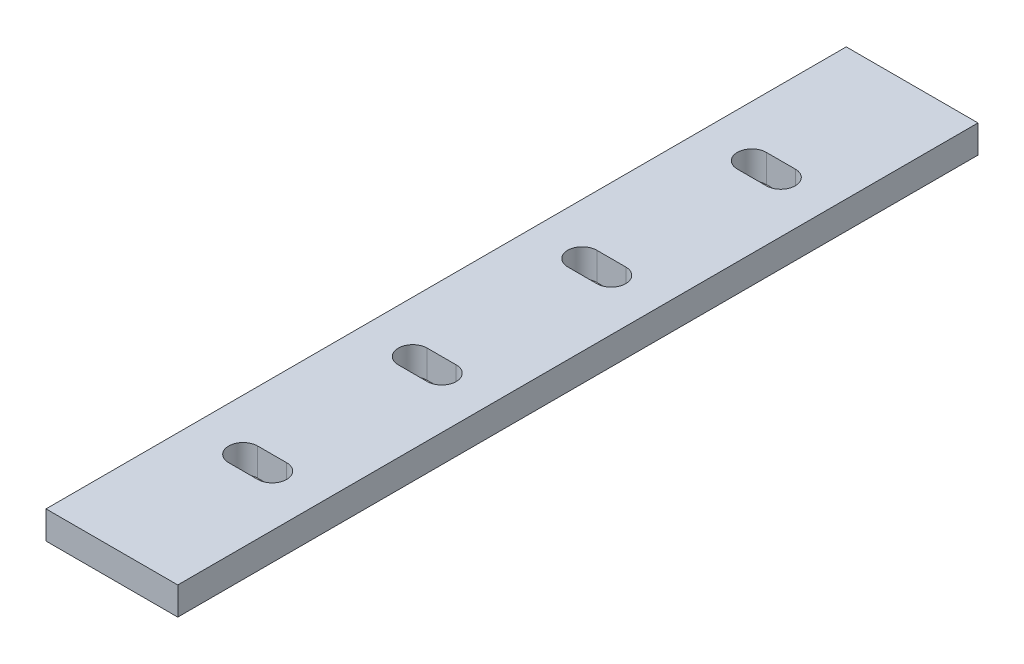
ISO-10303-21;
HEADER;
FILE_DESCRIPTION(('STEP AP214'),'2;1');
FILE_NAME('part.step','',(''),(''),'','','');
FILE_SCHEMA(('AUTOMOTIVE_DESIGN { 1 0 10303 214 1 1 1 1 }'));
ENDSEC;
DATA;
#1=APPLICATION_CONTEXT('core data for automotive mechanical design processes');
#2=APPLICATION_PROTOCOL_DEFINITION('international standard','automotive_design',2000,#1);
#3=PRODUCT_CONTEXT('',#1,'mechanical');
#4=PRODUCT('Part','Part','',(#3));
#5=PRODUCT_RELATED_PRODUCT_CATEGORY('part','',(#4));
#6=PRODUCT_DEFINITION_FORMATION('','',#4);
#7=PRODUCT_DEFINITION_CONTEXT('part definition',#1,'design');
#8=PRODUCT_DEFINITION('design','',#6,#7);
#9=PRODUCT_DEFINITION_SHAPE('','',#8);
#10=(LENGTH_UNIT() NAMED_UNIT(*) SI_UNIT(.MILLI.,.METRE.));
#11=(NAMED_UNIT(*) PLANE_ANGLE_UNIT() SI_UNIT($,.RADIAN.));
#12=(NAMED_UNIT(*) SI_UNIT($,.STERADIAN.) SOLID_ANGLE_UNIT());
#13=UNCERTAINTY_MEASURE_WITH_UNIT(LENGTH_MEASURE(1.E-05),#10,'distance_accuracy_value','');
#14=(GEOMETRIC_REPRESENTATION_CONTEXT(3) GLOBAL_UNCERTAINTY_ASSIGNED_CONTEXT((#13)) GLOBAL_UNIT_ASSIGNED_CONTEXT((#10,
#11,#12)) REPRESENTATION_CONTEXT('',''));
#15=CARTESIAN_POINT('',(0.,0.,0.));
#16=DIRECTION('',(0.,0.,1.));
#17=DIRECTION('',(1.,0.,0.));
#18=AXIS2_PLACEMENT_3D('',#15,#16,#17);
#19=CARTESIAN_POINT('',(0.,3.175,0.));
#20=DIRECTION('',(0.,-1.,0.));
#21=DIRECTION('',(0.,0.,-1.));
#22=AXIS2_PLACEMENT_3D('',#19,#20,#21);
#23=PLANE('',#22);
#24=CARTESIAN_POINT('',(9.15,3.175,-55.2));
#25=DIRECTION('',(0.,1.,0.));
#26=DIRECTION('',(0.,0.,1.));
#27=AXIS2_PLACEMENT_3D('',#24,#25,#26);
#28=CIRCLE('',#27,1.65000000000001);
#29=CARTESIAN_POINT('',(9.15,3.175,-53.55));
#30=VERTEX_POINT('',#29);
#31=CARTESIAN_POINT('',(9.15,3.175,-56.85));
#32=VERTEX_POINT('',#31);
#33=EDGE_CURVE('E214',#30,#32,#28,.T.);
#34=ORIENTED_EDGE('',*,*,#33,.F.);
#35=DIRECTION('',(1.,0.,0.));
#36=VECTOR('',#35,1.);
#37=CARTESIAN_POINT('',(9.15,3.175,-53.55));
#38=LINE('',#37,#36);
#39=CARTESIAN_POINT('',(5.85,3.175,-53.55));
#40=VERTEX_POINT('',#39);
#41=EDGE_CURVE('E222',#40,#30,#38,.T.);
#42=ORIENTED_EDGE('',*,*,#41,.F.);
#43=CARTESIAN_POINT('',(5.85,3.175,-55.2));
#44=DIRECTION('',(0.,1.,0.));
#45=DIRECTION('',(0.,0.,1.));
#46=AXIS2_PLACEMENT_3D('',#43,#44,#45);
#47=CIRCLE('',#46,1.65000000000001);
#48=CARTESIAN_POINT('',(5.85,3.175,-56.85));
#49=VERTEX_POINT('',#48);
#50=EDGE_CURVE('E219',#49,#40,#47,.T.);
#51=ORIENTED_EDGE('',*,*,#50,.F.);
#52=DIRECTION('',(-1.,0.,0.));
#53=VECTOR('',#52,1.);
#54=CARTESIAN_POINT('',(9.15,3.175,-56.85));
#55=LINE('',#54,#53);
#56=EDGE_CURVE('E216',#32,#49,#55,.T.);
#57=ORIENTED_EDGE('',*,*,#56,.F.);
#58=EDGE_LOOP('',(#34,#42,#51,#57));
#59=FACE_BOUND('',#58,.T.);
#60=CARTESIAN_POINT('',(9.15,3.175,-16.6));
#61=DIRECTION('',(0.,1.,0.));
#62=DIRECTION('',(0.,0.,1.));
#63=AXIS2_PLACEMENT_3D('',#60,#61,#62);
#64=CIRCLE('',#63,1.65);
#65=CARTESIAN_POINT('',(9.15,3.175,-14.95));
#66=VERTEX_POINT('',#65);
#67=CARTESIAN_POINT('',(9.15,3.175,-18.25));
#68=VERTEX_POINT('',#67);
#69=EDGE_CURVE('E276',#66,#68,#64,.T.);
#70=ORIENTED_EDGE('',*,*,#69,.F.);
#71=DIRECTION('',(1.,0.,0.));
#72=VECTOR('',#71,1.);
#73=CARTESIAN_POINT('',(9.15,3.175,-14.95));
#74=LINE('',#73,#72);
#75=CARTESIAN_POINT('',(5.85,3.175,-14.95));
#76=VERTEX_POINT('',#75);
#77=EDGE_CURVE('E284',#76,#66,#74,.T.);
#78=ORIENTED_EDGE('',*,*,#77,.F.);
#79=CARTESIAN_POINT('',(5.85,3.175,-16.6));
#80=DIRECTION('',(0.,1.,0.));
#81=DIRECTION('',(0.,0.,1.));
#82=AXIS2_PLACEMENT_3D('',#79,#80,#81);
#83=CIRCLE('',#82,1.65);
#84=CARTESIAN_POINT('',(5.85,3.175,-18.25));
#85=VERTEX_POINT('',#84);
#86=EDGE_CURVE('E281',#85,#76,#83,.T.);
#87=ORIENTED_EDGE('',*,*,#86,.F.);
#88=DIRECTION('',(-1.,0.,0.));
#89=VECTOR('',#88,1.);
#90=CARTESIAN_POINT('',(9.15,3.175,-18.25));
#91=LINE('',#90,#89);
#92=EDGE_CURVE('E278',#68,#85,#91,.T.);
#93=ORIENTED_EDGE('',*,*,#92,.F.);
#94=EDGE_LOOP('',(#70,#78,#87,#93));
#95=FACE_BOUND('',#94,.T.);
#96=DIRECTION('',(0.,0.,1.));
#97=VECTOR('',#96,1.);
#98=CARTESIAN_POINT('',(0.,3.175,0.));
#99=LINE('',#98,#97);
#100=CARTESIAN_POINT('',(0.,3.175,-91.1));
#101=VERTEX_POINT('',#100);
#102=CARTESIAN_POINT('',(0.,3.175,0.));
#103=VERTEX_POINT('',#102);
#104=EDGE_CURVE('E307',#101,#103,#99,.T.);
#105=ORIENTED_EDGE('',*,*,#104,.T.);
#106=DIRECTION('',(1.,0.,0.));
#107=VECTOR('',#106,1.);
#108=CARTESIAN_POINT('',(0.,3.175,0.));
#109=LINE('',#108,#107);
#110=CARTESIAN_POINT('',(15.,3.175,0.));
#111=VERTEX_POINT('',#110);
#112=EDGE_CURVE('E310',#103,#111,#109,.T.);
#113=ORIENTED_EDGE('',*,*,#112,.T.);
#114=DIRECTION('',(0.,0.,-1.));
#115=VECTOR('',#114,1.);
#116=CARTESIAN_POINT('',(15.,3.175,0.));
#117=LINE('',#116,#115);
#118=CARTESIAN_POINT('',(15.,3.175,-91.1));
#119=VERTEX_POINT('',#118);
#120=EDGE_CURVE('E313',#111,#119,#117,.T.);
#121=ORIENTED_EDGE('',*,*,#120,.T.);
#122=DIRECTION('',(-1.,0.,0.));
#123=VECTOR('',#122,1.);
#124=CARTESIAN_POINT('',(0.,3.175,-91.1));
#125=LINE('',#124,#123);
#126=EDGE_CURVE('E315',#119,#101,#125,.T.);
#127=ORIENTED_EDGE('',*,*,#126,.T.);
#128=EDGE_LOOP('',(#105,#113,#121,#127));
#129=FACE_BOUND('',#128,.T.);
#130=CARTESIAN_POINT('',(9.15,3.175,-35.9));
#131=DIRECTION('',(0.,1.,0.));
#132=DIRECTION('',(0.,0.,1.));
#133=AXIS2_PLACEMENT_3D('',#130,#131,#132);
#134=CIRCLE('',#133,1.65);
#135=CARTESIAN_POINT('',(9.15,3.175,-34.25));
#136=VERTEX_POINT('',#135);
#137=CARTESIAN_POINT('',(9.15,3.175,-37.55));
#138=VERTEX_POINT('',#137);
#139=EDGE_CURVE('E245',#136,#138,#134,.T.);
#140=ORIENTED_EDGE('',*,*,#139,.F.);
#141=DIRECTION('',(1.,0.,0.));
#142=VECTOR('',#141,1.);
#143=CARTESIAN_POINT('',(9.15,3.175,-34.25));
#144=LINE('',#143,#142);
#145=CARTESIAN_POINT('',(5.85,3.175,-34.25));
#146=VERTEX_POINT('',#145);
#147=EDGE_CURVE('E253',#146,#136,#144,.T.);
#148=ORIENTED_EDGE('',*,*,#147,.F.);
#149=CARTESIAN_POINT('',(5.85,3.175,-35.9));
#150=DIRECTION('',(0.,1.,0.));
#151=DIRECTION('',(0.,0.,1.));
#152=AXIS2_PLACEMENT_3D('',#149,#150,#151);
#153=CIRCLE('',#152,1.65);
#154=CARTESIAN_POINT('',(5.85,3.175,-37.55));
#155=VERTEX_POINT('',#154);
#156=EDGE_CURVE('E250',#155,#146,#153,.T.);
#157=ORIENTED_EDGE('',*,*,#156,.F.);
#158=DIRECTION('',(-1.,0.,0.));
#159=VECTOR('',#158,1.);
#160=CARTESIAN_POINT('',(9.15,3.175,-37.55));
#161=LINE('',#160,#159);
#162=EDGE_CURVE('E247',#138,#155,#161,.T.);
#163=ORIENTED_EDGE('',*,*,#162,.F.);
#164=EDGE_LOOP('',(#140,#148,#157,#163));
#165=FACE_BOUND('',#164,.T.);
#166=CARTESIAN_POINT('',(9.15,3.175,-74.5));
#167=DIRECTION('',(0.,1.,0.));
#168=DIRECTION('',(0.,0.,1.));
#169=AXIS2_PLACEMENT_3D('',#166,#167,#168);
#170=CIRCLE('',#169,1.65);
#171=CARTESIAN_POINT('',(9.15,3.175,-72.85));
#172=VERTEX_POINT('',#171);
#173=CARTESIAN_POINT('',(9.15,3.175,-76.15));
#174=VERTEX_POINT('',#173);
#175=EDGE_CURVE('E178',#172,#174,#170,.T.);
#176=ORIENTED_EDGE('',*,*,#175,.F.);
#177=DIRECTION('',(1.,0.,0.));
#178=VECTOR('',#177,1.);
#179=CARTESIAN_POINT('',(9.15,3.175,-72.85));
#180=LINE('',#179,#178);
#181=CARTESIAN_POINT('',(5.85,3.175,-72.85));
#182=VERTEX_POINT('',#181);
#183=EDGE_CURVE('E200',#182,#172,#180,.T.);
#184=ORIENTED_EDGE('',*,*,#183,.F.);
#185=CARTESIAN_POINT('',(5.85,3.175,-74.5));
#186=DIRECTION('',(0.,1.,0.));
#187=DIRECTION('',(0.,0.,1.));
#188=AXIS2_PLACEMENT_3D('',#185,#186,#187);
#189=CIRCLE('',#188,1.65);
#190=CARTESIAN_POINT('',(5.85,3.175,-76.15));
#191=VERTEX_POINT('',#190);
#192=EDGE_CURVE('E198',#191,#182,#189,.T.);
#193=ORIENTED_EDGE('',*,*,#192,.F.);
#194=DIRECTION('',(-1.,0.,0.));
#195=VECTOR('',#194,1.);
#196=CARTESIAN_POINT('',(9.15,3.175,-76.15));
#197=LINE('',#196,#195);
#198=EDGE_CURVE('E186',#174,#191,#197,.T.);
#199=ORIENTED_EDGE('',*,*,#198,.F.);
#200=EDGE_LOOP('',(#176,#184,#193,#199));
#201=FACE_BOUND('',#200,.T.);
#202=ADVANCED_FACE('F41',(#59,#95,#129,#165,#201),#23,.F.);
#203=CARTESIAN_POINT('',(0.,0.,0.));
#204=DIRECTION('',(0.,-1.,0.));
#205=DIRECTION('',(0.,0.,-1.));
#206=AXIS2_PLACEMENT_3D('',#203,#204,#205);
#207=PLANE('',#206);
#208=DIRECTION('',(0.,0.,1.));
#209=VECTOR('',#208,1.);
#210=CARTESIAN_POINT('',(0.,0.,0.));
#211=LINE('',#210,#209);
#212=CARTESIAN_POINT('',(0.,0.,-91.1));
#213=VERTEX_POINT('',#212);
#214=CARTESIAN_POINT('',(0.,0.,0.));
#215=VERTEX_POINT('',#214);
#216=EDGE_CURVE('E306',#213,#215,#211,.T.);
#217=ORIENTED_EDGE('',*,*,#216,.F.);
#218=DIRECTION('',(-1.,0.,0.));
#219=VECTOR('',#218,1.);
#220=CARTESIAN_POINT('',(0.,0.,-91.1));
#221=LINE('',#220,#219);
#222=CARTESIAN_POINT('',(15.,0.,-91.1));
#223=VERTEX_POINT('',#222);
#224=EDGE_CURVE('E311',#223,#213,#221,.T.);
#225=ORIENTED_EDGE('',*,*,#224,.F.);
#226=DIRECTION('',(0.,0.,-1.));
#227=VECTOR('',#226,1.);
#228=CARTESIAN_POINT('',(15.,0.,0.));
#229=LINE('',#228,#227);
#230=CARTESIAN_POINT('',(15.,0.,0.));
#231=VERTEX_POINT('',#230);
#232=EDGE_CURVE('E322',#231,#223,#229,.T.);
#233=ORIENTED_EDGE('',*,*,#232,.F.);
#234=DIRECTION('',(1.,0.,0.));
#235=VECTOR('',#234,1.);
#236=CARTESIAN_POINT('',(0.,0.,0.));
#237=LINE('',#236,#235);
#238=EDGE_CURVE('E320',#215,#231,#237,.T.);
#239=ORIENTED_EDGE('',*,*,#238,.F.);
#240=EDGE_LOOP('',(#217,#225,#233,#239));
#241=FACE_BOUND('',#240,.T.);
#242=DIRECTION('',(1.,0.,0.));
#243=VECTOR('',#242,1.);
#244=CARTESIAN_POINT('',(9.15,0.,-14.95));
#245=LINE('',#244,#243);
#246=CARTESIAN_POINT('',(5.85,0.,-14.95));
#247=VERTEX_POINT('',#246);
#248=CARTESIAN_POINT('',(9.15,0.,-14.95));
#249=VERTEX_POINT('',#248);
#250=EDGE_CURVE('E279',#247,#249,#245,.T.);
#251=ORIENTED_EDGE('',*,*,#250,.T.);
#252=CARTESIAN_POINT('',(9.15,0.,-16.6));
#253=DIRECTION('',(0.,1.,0.));
#254=DIRECTION('',(0.,0.,1.));
#255=AXIS2_PLACEMENT_3D('',#252,#253,#254);
#256=CIRCLE('',#255,1.65);
#257=CARTESIAN_POINT('',(9.15,0.,-18.25));
#258=VERTEX_POINT('',#257);
#259=EDGE_CURVE('E275',#249,#258,#256,.T.);
#260=ORIENTED_EDGE('',*,*,#259,.T.);
#261=DIRECTION('',(-1.,0.,0.));
#262=VECTOR('',#261,1.);
#263=CARTESIAN_POINT('',(9.15,0.,-18.25));
#264=LINE('',#263,#262);
#265=CARTESIAN_POINT('',(5.85,0.,-18.25));
#266=VERTEX_POINT('',#265);
#267=EDGE_CURVE('E289',#258,#266,#264,.T.);
#268=ORIENTED_EDGE('',*,*,#267,.T.);
#269=CARTESIAN_POINT('',(5.85,0.,-16.6));
#270=DIRECTION('',(0.,1.,0.));
#271=DIRECTION('',(0.,0.,1.));
#272=AXIS2_PLACEMENT_3D('',#269,#270,#271);
#273=CIRCLE('',#272,1.65);
#274=EDGE_CURVE('E292',#266,#247,#273,.T.);
#275=ORIENTED_EDGE('',*,*,#274,.T.);
#276=EDGE_LOOP('',(#251,#260,#268,#275));
#277=FACE_BOUND('',#276,.T.);
#278=DIRECTION('',(1.,0.,0.));
#279=VECTOR('',#278,1.);
#280=CARTESIAN_POINT('',(9.15,0.,-34.25));
#281=LINE('',#280,#279);
#282=CARTESIAN_POINT('',(5.85,0.,-34.25));
#283=VERTEX_POINT('',#282);
#284=CARTESIAN_POINT('',(9.15,0.,-34.25));
#285=VERTEX_POINT('',#284);
#286=EDGE_CURVE('E248',#283,#285,#281,.T.);
#287=ORIENTED_EDGE('',*,*,#286,.T.);
#288=CARTESIAN_POINT('',(9.15,0.,-35.9));
#289=DIRECTION('',(0.,1.,0.));
#290=DIRECTION('',(0.,0.,1.));
#291=AXIS2_PLACEMENT_3D('',#288,#289,#290);
#292=CIRCLE('',#291,1.65);
#293=CARTESIAN_POINT('',(9.15,0.,-37.55));
#294=VERTEX_POINT('',#293);
#295=EDGE_CURVE('E244',#285,#294,#292,.T.);
#296=ORIENTED_EDGE('',*,*,#295,.T.);
#297=DIRECTION('',(-1.,0.,0.));
#298=VECTOR('',#297,1.);
#299=CARTESIAN_POINT('',(9.15,0.,-37.55));
#300=LINE('',#299,#298);
#301=CARTESIAN_POINT('',(5.85,0.,-37.55));
#302=VERTEX_POINT('',#301);
#303=EDGE_CURVE('E258',#294,#302,#300,.T.);
#304=ORIENTED_EDGE('',*,*,#303,.T.);
#305=CARTESIAN_POINT('',(5.85,0.,-35.9));
#306=DIRECTION('',(0.,1.,0.));
#307=DIRECTION('',(0.,0.,1.));
#308=AXIS2_PLACEMENT_3D('',#305,#306,#307);
#309=CIRCLE('',#308,1.65);
#310=EDGE_CURVE('E261',#302,#283,#309,.T.);
#311=ORIENTED_EDGE('',*,*,#310,.T.);
#312=EDGE_LOOP('',(#287,#296,#304,#311));
#313=FACE_BOUND('',#312,.T.);
#314=DIRECTION('',(1.,0.,0.));
#315=VECTOR('',#314,1.);
#316=CARTESIAN_POINT('',(9.15,0.,-53.55));
#317=LINE('',#316,#315);
#318=CARTESIAN_POINT('',(5.85,0.,-53.55));
#319=VERTEX_POINT('',#318);
#320=CARTESIAN_POINT('',(9.15,0.,-53.55));
#321=VERTEX_POINT('',#320);
#322=EDGE_CURVE('E217',#319,#321,#317,.T.);
#323=ORIENTED_EDGE('',*,*,#322,.T.);
#324=CARTESIAN_POINT('',(9.15,0.,-55.2));
#325=DIRECTION('',(0.,1.,0.));
#326=DIRECTION('',(0.,0.,1.));
#327=AXIS2_PLACEMENT_3D('',#324,#325,#326);
#328=CIRCLE('',#327,1.65000000000001);
#329=CARTESIAN_POINT('',(9.15,0.,-56.85));
#330=VERTEX_POINT('',#329);
#331=EDGE_CURVE('E194',#321,#330,#328,.T.);
#332=ORIENTED_EDGE('',*,*,#331,.T.);
#333=DIRECTION('',(-1.,0.,0.));
#334=VECTOR('',#333,1.);
#335=CARTESIAN_POINT('',(9.15,0.,-56.85));
#336=LINE('',#335,#334);
#337=CARTESIAN_POINT('',(5.85,0.,-56.85));
#338=VERTEX_POINT('',#337);
#339=EDGE_CURVE('E227',#330,#338,#336,.T.);
#340=ORIENTED_EDGE('',*,*,#339,.T.);
#341=CARTESIAN_POINT('',(5.85,0.,-55.2));
#342=DIRECTION('',(0.,1.,0.));
#343=DIRECTION('',(0.,0.,1.));
#344=AXIS2_PLACEMENT_3D('',#341,#342,#343);
#345=CIRCLE('',#344,1.65000000000001);
#346=EDGE_CURVE('E230',#338,#319,#345,.T.);
#347=ORIENTED_EDGE('',*,*,#346,.T.);
#348=EDGE_LOOP('',(#323,#332,#340,#347));
#349=FACE_BOUND('',#348,.T.);
#350=DIRECTION('',(1.,0.,0.));
#351=VECTOR('',#350,1.);
#352=CARTESIAN_POINT('',(9.15,0.,-72.85));
#353=LINE('',#352,#351);
#354=CARTESIAN_POINT('',(5.85,0.,-72.85));
#355=VERTEX_POINT('',#354);
#356=CARTESIAN_POINT('',(9.15,0.,-72.85));
#357=VERTEX_POINT('',#356);
#358=EDGE_CURVE('E187',#355,#357,#353,.T.);
#359=ORIENTED_EDGE('',*,*,#358,.T.);
#360=CARTESIAN_POINT('',(9.15,0.,-74.5));
#361=DIRECTION('',(0.,1.,0.));
#362=DIRECTION('',(0.,0.,1.));
#363=AXIS2_PLACEMENT_3D('',#360,#361,#362);
#364=CIRCLE('',#363,1.65);
#365=CARTESIAN_POINT('',(9.15,0.,-76.15));
#366=VERTEX_POINT('',#365);
#367=EDGE_CURVE('E64',#357,#366,#364,.T.);
#368=ORIENTED_EDGE('',*,*,#367,.T.);
#369=DIRECTION('',(-1.,0.,0.));
#370=VECTOR('',#369,1.);
#371=CARTESIAN_POINT('',(9.15,0.,-76.15));
#372=LINE('',#371,#370);
#373=CARTESIAN_POINT('',(5.85,0.,-76.15));
#374=VERTEX_POINT('',#373);
#375=EDGE_CURVE('E193',#366,#374,#372,.T.);
#376=ORIENTED_EDGE('',*,*,#375,.T.);
#377=CARTESIAN_POINT('',(5.85,0.,-74.5));
#378=DIRECTION('',(0.,1.,0.));
#379=DIRECTION('',(0.,0.,1.));
#380=AXIS2_PLACEMENT_3D('',#377,#378,#379);
#381=CIRCLE('',#380,1.65);
#382=EDGE_CURVE('E206',#374,#355,#381,.T.);
#383=ORIENTED_EDGE('',*,*,#382,.T.);
#384=EDGE_LOOP('',(#359,#368,#376,#383));
#385=FACE_BOUND('',#384,.T.);
#386=ADVANCED_FACE('F340',(#241,#277,#313,#349,#385),#207,.T.);
#387=CARTESIAN_POINT('',(0.,3.175,0.));
#388=DIRECTION('',(1.,0.,0.));
#389=DIRECTION('',(0.,0.,-1.));
#390=AXIS2_PLACEMENT_3D('',#387,#388,#389);
#391=PLANE('',#390);
#392=ORIENTED_EDGE('',*,*,#216,.T.);
#393=DIRECTION('',(0.,-1.,0.));
#394=VECTOR('',#393,1.);
#395=CARTESIAN_POINT('',(0.,3.175,0.));
#396=LINE('',#395,#394);
#397=EDGE_CURVE('E11',#103,#215,#396,.T.);
#398=ORIENTED_EDGE('',*,*,#397,.F.);
#399=ORIENTED_EDGE('',*,*,#104,.F.);
#400=DIRECTION('',(0.,-1.,0.));
#401=VECTOR('',#400,1.);
#402=CARTESIAN_POINT('',(0.,3.175,-91.1));
#403=LINE('',#402,#401);
#404=EDGE_CURVE('E317',#101,#213,#403,.T.);
#405=ORIENTED_EDGE('',*,*,#404,.T.);
#406=EDGE_LOOP('',(#392,#398,#399,#405));
#407=FACE_BOUND('',#406,.T.);
#408=ADVANCED_FACE('F43',(#407),#391,.F.);
#409=CARTESIAN_POINT('',(0.,3.175,0.));
#410=DIRECTION('',(0.,0.,-1.));
#411=DIRECTION('',(-1.,0.,0.));
#412=AXIS2_PLACEMENT_3D('',#409,#410,#411);
#413=PLANE('',#412);
#414=ORIENTED_EDGE('',*,*,#238,.T.);
#415=DIRECTION('',(0.,-1.,0.));
#416=VECTOR('',#415,1.);
#417=CARTESIAN_POINT('',(15.,3.175,0.));
#418=LINE('',#417,#416);
#419=EDGE_CURVE('E49',#111,#231,#418,.T.);
#420=ORIENTED_EDGE('',*,*,#419,.F.);
#421=ORIENTED_EDGE('',*,*,#112,.F.);
#422=ORIENTED_EDGE('',*,*,#397,.T.);
#423=EDGE_LOOP('',(#414,#420,#421,#422));
#424=FACE_BOUND('',#423,.T.);
#425=ADVANCED_FACE('F351',(#424),#413,.F.);
#426=CARTESIAN_POINT('',(15.,3.175,0.));
#427=DIRECTION('',(-1.,0.,0.));
#428=DIRECTION('',(0.,0.,1.));
#429=AXIS2_PLACEMENT_3D('',#426,#427,#428);
#430=PLANE('',#429);
#431=ORIENTED_EDGE('',*,*,#232,.T.);
#432=DIRECTION('',(0.,-1.,0.));
#433=VECTOR('',#432,1.);
#434=CARTESIAN_POINT('',(15.,3.175,-91.1));
#435=LINE('',#434,#433);
#436=EDGE_CURVE('E327',#119,#223,#435,.T.);
#437=ORIENTED_EDGE('',*,*,#436,.F.);
#438=ORIENTED_EDGE('',*,*,#120,.F.);
#439=ORIENTED_EDGE('',*,*,#419,.T.);
#440=EDGE_LOOP('',(#431,#437,#438,#439));
#441=FACE_BOUND('',#440,.T.);
#442=ADVANCED_FACE('F334',(#441),#430,.F.);
#443=CARTESIAN_POINT('',(0.,3.175,-91.1));
#444=DIRECTION('',(0.,0.,1.));
#445=DIRECTION('',(1.,0.,0.));
#446=AXIS2_PLACEMENT_3D('',#443,#444,#445);
#447=PLANE('',#446);
#448=ORIENTED_EDGE('',*,*,#224,.T.);
#449=ORIENTED_EDGE('',*,*,#404,.F.);
#450=ORIENTED_EDGE('',*,*,#126,.F.);
#451=ORIENTED_EDGE('',*,*,#436,.T.);
#452=EDGE_LOOP('',(#448,#449,#450,#451));
#453=FACE_BOUND('',#452,.T.);
#454=ADVANCED_FACE('F344',(#453),#447,.F.);
#455=CARTESIAN_POINT('',(9.15,3.175,-16.6));
#456=DIRECTION('',(0.,-1.,0.));
#457=DIRECTION('',(0.,0.,-1.));
#458=AXIS2_PLACEMENT_3D('',#455,#456,#457);
#459=CYLINDRICAL_SURFACE('',#458,1.65);
#460=ORIENTED_EDGE('',*,*,#259,.F.);
#461=DIRECTION('',(0.,-1.,0.));
#462=VECTOR('',#461,1.);
#463=CARTESIAN_POINT('',(9.15,3.175,-14.95));
#464=LINE('',#463,#462);
#465=EDGE_CURVE('E286',#66,#249,#464,.T.);
#466=ORIENTED_EDGE('',*,*,#465,.F.);
#467=ORIENTED_EDGE('',*,*,#69,.T.);
#468=DIRECTION('',(0.,-1.,0.));
#469=VECTOR('',#468,1.);
#470=CARTESIAN_POINT('',(9.15,3.175,-18.25));
#471=LINE('',#470,#469);
#472=EDGE_CURVE('E303',#68,#258,#471,.T.);
#473=ORIENTED_EDGE('',*,*,#472,.T.);
#474=EDGE_LOOP('',(#460,#466,#467,#473));
#475=FACE_BOUND('',#474,.T.);
#476=ADVANCED_FACE('F368',(#475),#459,.F.);
#477=CARTESIAN_POINT('',(9.15,3.175,-18.25));
#478=DIRECTION('',(0.,0.,1.));
#479=DIRECTION('',(1.,0.,0.));
#480=AXIS2_PLACEMENT_3D('',#477,#478,#479);
#481=PLANE('',#480);
#482=ORIENTED_EDGE('',*,*,#267,.F.);
#483=ORIENTED_EDGE('',*,*,#472,.F.);
#484=ORIENTED_EDGE('',*,*,#92,.T.);
#485=DIRECTION('',(0.,-1.,0.));
#486=VECTOR('',#485,1.);
#487=CARTESIAN_POINT('',(5.85,3.175,-18.25));
#488=LINE('',#487,#486);
#489=EDGE_CURVE('E301',#85,#266,#488,.T.);
#490=ORIENTED_EDGE('',*,*,#489,.T.);
#491=EDGE_LOOP('',(#482,#483,#484,#490));
#492=FACE_BOUND('',#491,.T.);
#493=ADVANCED_FACE('F375',(#492),#481,.T.);
#494=CARTESIAN_POINT('',(5.85,3.175,-16.6));
#495=DIRECTION('',(0.,-1.,0.));
#496=DIRECTION('',(0.,0.,-1.));
#497=AXIS2_PLACEMENT_3D('',#494,#495,#496);
#498=CYLINDRICAL_SURFACE('',#497,1.65);
#499=ORIENTED_EDGE('',*,*,#274,.F.);
#500=ORIENTED_EDGE('',*,*,#489,.F.);
#501=ORIENTED_EDGE('',*,*,#86,.T.);
#502=DIRECTION('',(0.,-1.,0.));
#503=VECTOR('',#502,1.);
#504=CARTESIAN_POINT('',(5.85,3.175,-14.95));
#505=LINE('',#504,#503);
#506=EDGE_CURVE('E299',#76,#247,#505,.T.);
#507=ORIENTED_EDGE('',*,*,#506,.T.);
#508=EDGE_LOOP('',(#499,#500,#501,#507));
#509=FACE_BOUND('',#508,.T.);
#510=ADVANCED_FACE('F380',(#509),#498,.F.);
#511=CARTESIAN_POINT('',(9.15,3.175,-14.95));
#512=DIRECTION('',(0.,0.,-1.));
#513=DIRECTION('',(-1.,0.,0.));
#514=AXIS2_PLACEMENT_3D('',#511,#512,#513);
#515=PLANE('',#514);
#516=ORIENTED_EDGE('',*,*,#250,.F.);
#517=ORIENTED_EDGE('',*,*,#506,.F.);
#518=ORIENTED_EDGE('',*,*,#77,.T.);
#519=ORIENTED_EDGE('',*,*,#465,.T.);
#520=EDGE_LOOP('',(#516,#517,#518,#519));
#521=FACE_BOUND('',#520,.T.);
#522=ADVANCED_FACE('F387',(#521),#515,.T.);
#523=CARTESIAN_POINT('',(9.15,3.175,-35.9));
#524=DIRECTION('',(0.,-1.,0.));
#525=DIRECTION('',(0.,0.,-1.));
#526=AXIS2_PLACEMENT_3D('',#523,#524,#525);
#527=CYLINDRICAL_SURFACE('',#526,1.65);
#528=ORIENTED_EDGE('',*,*,#295,.F.);
#529=DIRECTION('',(0.,-1.,0.));
#530=VECTOR('',#529,1.);
#531=CARTESIAN_POINT('',(9.15,3.175,-34.25));
#532=LINE('',#531,#530);
#533=EDGE_CURVE('E255',#136,#285,#532,.T.);
#534=ORIENTED_EDGE('',*,*,#533,.F.);
#535=ORIENTED_EDGE('',*,*,#139,.T.);
#536=DIRECTION('',(0.,-1.,0.));
#537=VECTOR('',#536,1.);
#538=CARTESIAN_POINT('',(9.15,3.175,-37.55));
#539=LINE('',#538,#537);
#540=EDGE_CURVE('E272',#138,#294,#539,.T.);
#541=ORIENTED_EDGE('',*,*,#540,.T.);
#542=EDGE_LOOP('',(#528,#534,#535,#541));
#543=FACE_BOUND('',#542,.T.);
#544=ADVANCED_FACE('F400',(#543),#527,.F.);
#545=CARTESIAN_POINT('',(9.15,3.175,-37.55));
#546=DIRECTION('',(0.,0.,1.));
#547=DIRECTION('',(1.,0.,0.));
#548=AXIS2_PLACEMENT_3D('',#545,#546,#547);
#549=PLANE('',#548);
#550=ORIENTED_EDGE('',*,*,#303,.F.);
#551=ORIENTED_EDGE('',*,*,#540,.F.);
#552=ORIENTED_EDGE('',*,*,#162,.T.);
#553=DIRECTION('',(0.,-1.,0.));
#554=VECTOR('',#553,1.);
#555=CARTESIAN_POINT('',(5.85,3.175,-37.55));
#556=LINE('',#555,#554);
#557=EDGE_CURVE('E270',#155,#302,#556,.T.);
#558=ORIENTED_EDGE('',*,*,#557,.T.);
#559=EDGE_LOOP('',(#550,#551,#552,#558));
#560=FACE_BOUND('',#559,.T.);
#561=ADVANCED_FACE('F405',(#560),#549,.T.);
#562=CARTESIAN_POINT('',(5.85,3.175,-35.9));
#563=DIRECTION('',(0.,-1.,0.));
#564=DIRECTION('',(0.,0.,-1.));
#565=AXIS2_PLACEMENT_3D('',#562,#563,#564);
#566=CYLINDRICAL_SURFACE('',#565,1.65);
#567=ORIENTED_EDGE('',*,*,#310,.F.);
#568=ORIENTED_EDGE('',*,*,#557,.F.);
#569=ORIENTED_EDGE('',*,*,#156,.T.);
#570=DIRECTION('',(0.,-1.,0.));
#571=VECTOR('',#570,1.);
#572=CARTESIAN_POINT('',(5.85,3.175,-34.25));
#573=LINE('',#572,#571);
#574=EDGE_CURVE('E268',#146,#283,#573,.T.);
#575=ORIENTED_EDGE('',*,*,#574,.T.);
#576=EDGE_LOOP('',(#567,#568,#569,#575));
#577=FACE_BOUND('',#576,.T.);
#578=ADVANCED_FACE('F409',(#577),#566,.F.);
#579=CARTESIAN_POINT('',(9.15,3.175,-34.25));
#580=DIRECTION('',(0.,0.,-1.));
#581=DIRECTION('',(-1.,0.,0.));
#582=AXIS2_PLACEMENT_3D('',#579,#580,#581);
#583=PLANE('',#582);
#584=ORIENTED_EDGE('',*,*,#286,.F.);
#585=ORIENTED_EDGE('',*,*,#574,.F.);
#586=ORIENTED_EDGE('',*,*,#147,.T.);
#587=ORIENTED_EDGE('',*,*,#533,.T.);
#588=EDGE_LOOP('',(#584,#585,#586,#587));
#589=FACE_BOUND('',#588,.T.);
#590=ADVANCED_FACE('F413',(#589),#583,.T.);
#591=CARTESIAN_POINT('',(9.15,3.175,-55.2));
#592=DIRECTION('',(0.,-1.,0.));
#593=DIRECTION('',(0.,0.,-1.));
#594=AXIS2_PLACEMENT_3D('',#591,#592,#593);
#595=CYLINDRICAL_SURFACE('',#594,1.65000000000001);
#596=ORIENTED_EDGE('',*,*,#331,.F.);
#597=DIRECTION('',(0.,-1.,0.));
#598=VECTOR('',#597,1.);
#599=CARTESIAN_POINT('',(9.15,3.175,-53.55));
#600=LINE('',#599,#598);
#601=EDGE_CURVE('E224',#30,#321,#600,.T.);
#602=ORIENTED_EDGE('',*,*,#601,.F.);
#603=ORIENTED_EDGE('',*,*,#33,.T.);
#604=DIRECTION('',(0.,-1.,0.));
#605=VECTOR('',#604,1.);
#606=CARTESIAN_POINT('',(9.15,3.175,-56.85));
#607=LINE('',#606,#605);
#608=EDGE_CURVE('E241',#32,#330,#607,.T.);
#609=ORIENTED_EDGE('',*,*,#608,.T.);
#610=EDGE_LOOP('',(#596,#602,#603,#609));
#611=FACE_BOUND('',#610,.T.);
#612=ADVANCED_FACE('F417',(#611),#595,.F.);
#613=CARTESIAN_POINT('',(9.15,3.175,-56.85));
#614=DIRECTION('',(0.,0.,1.));
#615=DIRECTION('',(1.,0.,0.));
#616=AXIS2_PLACEMENT_3D('',#613,#614,#615);
#617=PLANE('',#616);
#618=ORIENTED_EDGE('',*,*,#339,.F.);
#619=ORIENTED_EDGE('',*,*,#608,.F.);
#620=ORIENTED_EDGE('',*,*,#56,.T.);
#621=DIRECTION('',(0.,-1.,0.));
#622=VECTOR('',#621,1.);
#623=CARTESIAN_POINT('',(5.85,3.175,-56.85));
#624=LINE('',#623,#622);
#625=EDGE_CURVE('E239',#49,#338,#624,.T.);
#626=ORIENTED_EDGE('',*,*,#625,.T.);
#627=EDGE_LOOP('',(#618,#619,#620,#626));
#628=FACE_BOUND('',#627,.T.);
#629=ADVANCED_FACE('F421',(#628),#617,.T.);
#630=CARTESIAN_POINT('',(5.85,3.175,-55.2));
#631=DIRECTION('',(0.,-1.,0.));
#632=DIRECTION('',(0.,0.,-1.));
#633=AXIS2_PLACEMENT_3D('',#630,#631,#632);
#634=CYLINDRICAL_SURFACE('',#633,1.65000000000001);
#635=ORIENTED_EDGE('',*,*,#346,.F.);
#636=ORIENTED_EDGE('',*,*,#625,.F.);
#637=ORIENTED_EDGE('',*,*,#50,.T.);
#638=DIRECTION('',(0.,-1.,0.));
#639=VECTOR('',#638,1.);
#640=CARTESIAN_POINT('',(5.85,3.175,-53.55));
#641=LINE('',#640,#639);
#642=EDGE_CURVE('E237',#40,#319,#641,.T.);
#643=ORIENTED_EDGE('',*,*,#642,.T.);
#644=EDGE_LOOP('',(#635,#636,#637,#643));
#645=FACE_BOUND('',#644,.T.);
#646=ADVANCED_FACE('F425',(#645),#634,.F.);
#647=CARTESIAN_POINT('',(9.15,3.175,-53.55));
#648=DIRECTION('',(0.,0.,-1.));
#649=DIRECTION('',(-1.,0.,0.));
#650=AXIS2_PLACEMENT_3D('',#647,#648,#649);
#651=PLANE('',#650);
#652=ORIENTED_EDGE('',*,*,#322,.F.);
#653=ORIENTED_EDGE('',*,*,#642,.F.);
#654=ORIENTED_EDGE('',*,*,#41,.T.);
#655=ORIENTED_EDGE('',*,*,#601,.T.);
#656=EDGE_LOOP('',(#652,#653,#654,#655));
#657=FACE_BOUND('',#656,.T.);
#658=ADVANCED_FACE('F429',(#657),#651,.T.);
#659=CARTESIAN_POINT('',(9.15,3.175,-74.5));
#660=DIRECTION('',(0.,-1.,0.));
#661=DIRECTION('',(0.,0.,-1.));
#662=AXIS2_PLACEMENT_3D('',#659,#660,#661);
#663=CYLINDRICAL_SURFACE('',#662,1.65);
#664=ORIENTED_EDGE('',*,*,#367,.F.);
#665=DIRECTION('',(0.,-1.,0.));
#666=VECTOR('',#665,1.);
#667=CARTESIAN_POINT('',(9.15,3.175,-72.85));
#668=LINE('',#667,#666);
#669=EDGE_CURVE('E182',#172,#357,#668,.T.);
#670=ORIENTED_EDGE('',*,*,#669,.F.);
#671=ORIENTED_EDGE('',*,*,#175,.T.);
#672=DIRECTION('',(0.,-1.,0.));
#673=VECTOR('',#672,1.);
#674=CARTESIAN_POINT('',(9.15,3.175,-76.15));
#675=LINE('',#674,#673);
#676=EDGE_CURVE('E181',#174,#366,#675,.T.);
#677=ORIENTED_EDGE('',*,*,#676,.T.);
#678=EDGE_LOOP('',(#664,#670,#671,#677));
#679=FACE_BOUND('',#678,.T.);
#680=ADVANCED_FACE('F180',(#679),#663,.F.);
#681=CARTESIAN_POINT('',(9.15,3.175,-76.15));
#682=DIRECTION('',(0.,0.,1.));
#683=DIRECTION('',(1.,0.,0.));
#684=AXIS2_PLACEMENT_3D('',#681,#682,#683);
#685=PLANE('',#684);
#686=ORIENTED_EDGE('',*,*,#375,.F.);
#687=ORIENTED_EDGE('',*,*,#676,.F.);
#688=ORIENTED_EDGE('',*,*,#198,.T.);
#689=DIRECTION('',(0.,-1.,0.));
#690=VECTOR('',#689,1.);
#691=CARTESIAN_POINT('',(5.85,3.175,-76.15));
#692=LINE('',#691,#690);
#693=EDGE_CURVE('E195',#191,#374,#692,.T.);
#694=ORIENTED_EDGE('',*,*,#693,.T.);
#695=EDGE_LOOP('',(#686,#687,#688,#694));
#696=FACE_BOUND('',#695,.T.);
#697=ADVANCED_FACE('F190',(#696),#685,.T.);
#698=CARTESIAN_POINT('',(5.85,3.175,-74.5));
#699=DIRECTION('',(0.,-1.,0.));
#700=DIRECTION('',(0.,0.,-1.));
#701=AXIS2_PLACEMENT_3D('',#698,#699,#700);
#702=CYLINDRICAL_SURFACE('',#701,1.65);
#703=ORIENTED_EDGE('',*,*,#382,.F.);
#704=ORIENTED_EDGE('',*,*,#693,.F.);
#705=ORIENTED_EDGE('',*,*,#192,.T.);
#706=DIRECTION('',(0.,-1.,0.));
#707=VECTOR('',#706,1.);
#708=CARTESIAN_POINT('',(5.85,3.175,-72.85));
#709=LINE('',#708,#707);
#710=EDGE_CURVE('E56',#182,#355,#709,.T.);
#711=ORIENTED_EDGE('',*,*,#710,.T.);
#712=EDGE_LOOP('',(#703,#704,#705,#711));
#713=FACE_BOUND('',#712,.T.);
#714=ADVANCED_FACE('F438',(#713),#702,.F.);
#715=CARTESIAN_POINT('',(9.15,3.175,-72.85));
#716=DIRECTION('',(0.,0.,-1.));
#717=DIRECTION('',(-1.,0.,0.));
#718=AXIS2_PLACEMENT_3D('',#715,#716,#717);
#719=PLANE('',#718);
#720=ORIENTED_EDGE('',*,*,#358,.F.);
#721=ORIENTED_EDGE('',*,*,#710,.F.);
#722=ORIENTED_EDGE('',*,*,#183,.T.);
#723=ORIENTED_EDGE('',*,*,#669,.T.);
#724=EDGE_LOOP('',(#720,#721,#722,#723));
#725=FACE_BOUND('',#724,.T.);
#726=ADVANCED_FACE('F441',(#725),#719,.T.);
#727=CLOSED_SHELL('',(#202,#386,#408,#425,#442,#454,#476,#493,#510,#522,#544,#561,#578,#590,
#612,#629,#646,#658,#680,#697,#714,#726));
#728=MANIFOLD_SOLID_BREP('B2',#727);
#729=ADVANCED_BREP_SHAPE_REPRESENTATION('',(#18,#728),#14);
#730=SHAPE_DEFINITION_REPRESENTATION(#9,#729);
ENDSEC;
END-ISO-10303-21;
